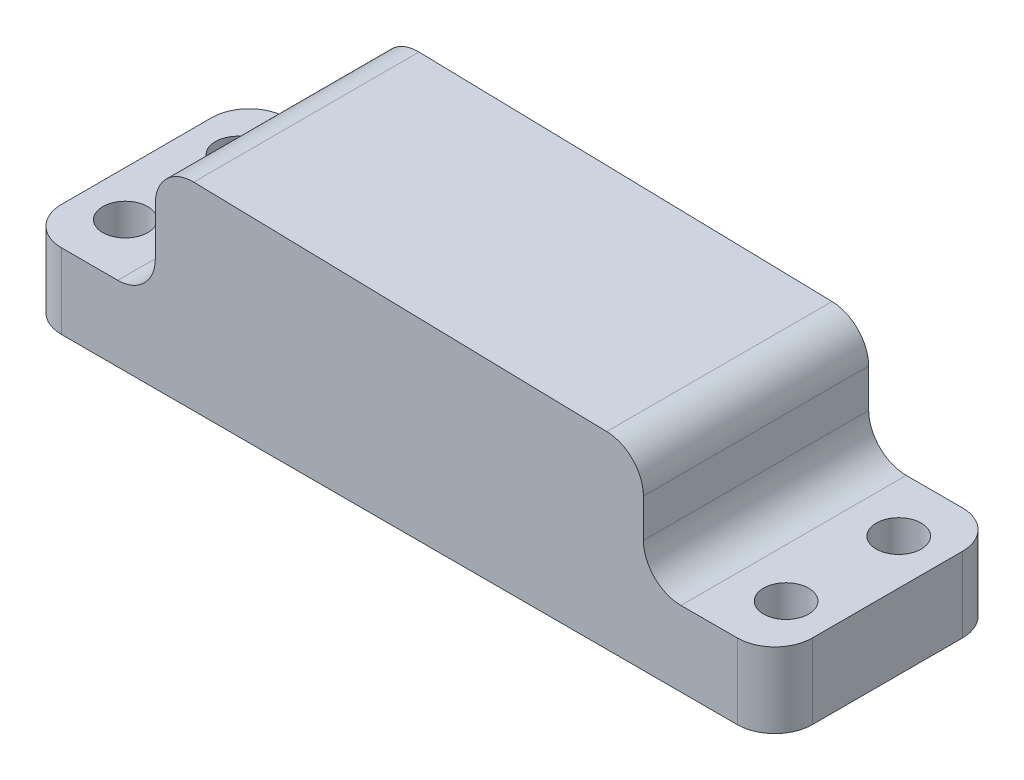
ISO-10303-21;
HEADER;
FILE_DESCRIPTION(('STEP AP214'),'2;1');
FILE_NAME('part.step','',(''),(''),'','','');
FILE_SCHEMA(('AUTOMOTIVE_DESIGN { 1 0 10303 214 1 1 1 1 }'));
ENDSEC;
DATA;
#1=APPLICATION_CONTEXT('core data for automotive mechanical design processes');
#2=APPLICATION_PROTOCOL_DEFINITION('international standard','automotive_design',2000,#1);
#3=PRODUCT_CONTEXT('',#1,'mechanical');
#4=PRODUCT('Part','Part','',(#3));
#5=PRODUCT_RELATED_PRODUCT_CATEGORY('part','',(#4));
#6=PRODUCT_DEFINITION_FORMATION('','',#4);
#7=PRODUCT_DEFINITION_CONTEXT('part definition',#1,'design');
#8=PRODUCT_DEFINITION('design','',#6,#7);
#9=PRODUCT_DEFINITION_SHAPE('','',#8);
#10=(LENGTH_UNIT() NAMED_UNIT(*) SI_UNIT(.MILLI.,.METRE.));
#11=(NAMED_UNIT(*) PLANE_ANGLE_UNIT() SI_UNIT($,.RADIAN.));
#12=(NAMED_UNIT(*) SI_UNIT($,.STERADIAN.) SOLID_ANGLE_UNIT());
#13=UNCERTAINTY_MEASURE_WITH_UNIT(LENGTH_MEASURE(1.E-05),#10,'distance_accuracy_value','');
#14=(GEOMETRIC_REPRESENTATION_CONTEXT(3) GLOBAL_UNCERTAINTY_ASSIGNED_CONTEXT((#13)) GLOBAL_UNIT_ASSIGNED_CONTEXT((#10,
#11,#12)) REPRESENTATION_CONTEXT('',''));
#15=CARTESIAN_POINT('',(0.,0.,0.));
#16=DIRECTION('',(0.,0.,1.));
#17=DIRECTION('',(1.,0.,0.));
#18=AXIS2_PLACEMENT_3D('',#15,#16,#17);
#19=CARTESIAN_POINT('',(200.,0.,60.));
#20=DIRECTION('',(0.,-1.,0.));
#21=DIRECTION('',(0.,0.,-1.));
#22=AXIS2_PLACEMENT_3D('',#19,#20,#21);
#23=PLANE('',#22);
#24=CARTESIAN_POINT('',(188.,0.,45.));
#25=DIRECTION('',(0.,1.,0.));
#26=DIRECTION('',(0.,0.,1.));
#27=AXIS2_PLACEMENT_3D('',#24,#25,#26);
#28=CIRCLE('',#27,4.);
#29=CARTESIAN_POINT('',(188.,0.,49.));
#30=VERTEX_POINT('',#29);
#31=EDGE_CURVE('E359',#30,#30,#28,.T.);
#32=ORIENTED_EDGE('',*,*,#31,.T.);
#33=EDGE_LOOP('',(#32));
#34=FACE_BOUND('',#33,.T.);
#35=CARTESIAN_POINT('',(188.,0.,15.));
#36=DIRECTION('',(0.,1.,0.));
#37=DIRECTION('',(0.,0.,1.));
#38=AXIS2_PLACEMENT_3D('',#35,#36,#37);
#39=CIRCLE('',#38,4.);
#40=CARTESIAN_POINT('',(188.,0.,19.));
#41=VERTEX_POINT('',#40);
#42=EDGE_CURVE('E347',#41,#41,#39,.T.);
#43=ORIENTED_EDGE('',*,*,#42,.T.);
#44=EDGE_LOOP('',(#43));
#45=FACE_BOUND('',#44,.T.);
#46=DIRECTION('',(0.,0.,-1.));
#47=VECTOR('',#46,1.);
#48=CARTESIAN_POINT('',(0.,0.,60.));
#49=LINE('',#48,#47);
#50=CARTESIAN_POINT('',(0.,0.,50.));
#51=VERTEX_POINT('',#50);
#52=CARTESIAN_POINT('',(0.,0.,10.));
#53=VERTEX_POINT('',#52);
#54=EDGE_CURVE('E263',#51,#53,#49,.T.);
#55=ORIENTED_EDGE('',*,*,#54,.T.);
#56=CARTESIAN_POINT('',(10.,0.,10.));
#57=DIRECTION('',(0.,-1.,0.));
#58=DIRECTION('',(0.,0.,-1.));
#59=AXIS2_PLACEMENT_3D('',#56,#57,#58);
#60=CIRCLE('',#59,10.);
#61=CARTESIAN_POINT('',(10.,0.,0.));
#62=VERTEX_POINT('',#61);
#63=EDGE_CURVE('E240',#53,#62,#60,.T.);
#64=ORIENTED_EDGE('',*,*,#63,.T.);
#65=DIRECTION('',(-1.,0.,0.));
#66=VECTOR('',#65,1.);
#67=CARTESIAN_POINT('',(200.,0.,0.));
#68=LINE('',#67,#66);
#69=CARTESIAN_POINT('',(190.,0.,0.));
#70=VERTEX_POINT('',#69);
#71=EDGE_CURVE('E257',#70,#62,#68,.T.);
#72=ORIENTED_EDGE('',*,*,#71,.F.);
#73=CARTESIAN_POINT('',(190.,0.,10.));
#74=DIRECTION('',(0.,-1.,0.));
#75=DIRECTION('',(0.,0.,-1.));
#76=AXIS2_PLACEMENT_3D('',#73,#74,#75);
#77=CIRCLE('',#76,10.);
#78=CARTESIAN_POINT('',(200.,0.,10.));
#79=VERTEX_POINT('',#78);
#80=EDGE_CURVE('E231',#70,#79,#77,.T.);
#81=ORIENTED_EDGE('',*,*,#80,.T.);
#82=DIRECTION('',(0.,0.,-1.));
#83=VECTOR('',#82,1.);
#84=CARTESIAN_POINT('',(200.,0.,60.));
#85=LINE('',#84,#83);
#86=CARTESIAN_POINT('',(200.,0.,50.));
#87=VERTEX_POINT('',#86);
#88=EDGE_CURVE('E186',#87,#79,#85,.T.);
#89=ORIENTED_EDGE('',*,*,#88,.F.);
#90=CARTESIAN_POINT('',(190.,0.,50.));
#91=DIRECTION('',(0.,-1.,0.));
#92=DIRECTION('',(0.,0.,-1.));
#93=AXIS2_PLACEMENT_3D('',#90,#91,#92);
#94=CIRCLE('',#93,10.);
#95=CARTESIAN_POINT('',(190.,0.,60.));
#96=VERTEX_POINT('',#95);
#97=EDGE_CURVE('E234',#87,#96,#94,.T.);
#98=ORIENTED_EDGE('',*,*,#97,.T.);
#99=DIRECTION('',(-1.,0.,0.));
#100=VECTOR('',#99,1.);
#101=CARTESIAN_POINT('',(200.,0.,60.));
#102=LINE('',#101,#100);
#103=CARTESIAN_POINT('',(10.,0.,60.));
#104=VERTEX_POINT('',#103);
#105=EDGE_CURVE('E255',#96,#104,#102,.T.);
#106=ORIENTED_EDGE('',*,*,#105,.T.);
#107=CARTESIAN_POINT('',(10.,0.,50.));
#108=DIRECTION('',(0.,-1.,0.));
#109=DIRECTION('',(0.,0.,-1.));
#110=AXIS2_PLACEMENT_3D('',#107,#108,#109);
#111=CIRCLE('',#110,10.);
#112=EDGE_CURVE('E235',#104,#51,#111,.T.);
#113=ORIENTED_EDGE('',*,*,#112,.T.);
#114=EDGE_LOOP('',(#55,#64,#72,#81,#89,#98,#106,#113));
#115=FACE_BOUND('',#114,.T.);
#116=CARTESIAN_POINT('',(12.,0.,45.));
#117=DIRECTION('',(0.,1.,0.));
#118=DIRECTION('',(0.,0.,1.));
#119=AXIS2_PLACEMENT_3D('',#116,#117,#118);
#120=CIRCLE('',#119,4.);
#121=CARTESIAN_POINT('',(12.,0.,49.));
#122=VERTEX_POINT('',#121);
#123=EDGE_CURVE('E273',#122,#122,#120,.T.);
#124=ORIENTED_EDGE('',*,*,#123,.T.);
#125=EDGE_LOOP('',(#124));
#126=FACE_BOUND('',#125,.T.);
#127=CARTESIAN_POINT('',(12.,0.,15.));
#128=DIRECTION('',(0.,1.,0.));
#129=DIRECTION('',(0.,0.,1.));
#130=AXIS2_PLACEMENT_3D('',#127,#128,#129);
#131=CIRCLE('',#130,4.);
#132=CARTESIAN_POINT('',(12.,0.,19.));
#133=VERTEX_POINT('',#132);
#134=EDGE_CURVE('E331',#133,#133,#131,.T.);
#135=ORIENTED_EDGE('',*,*,#134,.T.);
#136=EDGE_LOOP('',(#135));
#137=FACE_BOUND('',#136,.T.);
#138=ADVANCED_FACE('F41',(#34,#45,#115,#126,#137),#23,.T.);
#139=CARTESIAN_POINT('',(200.,20.,60.));
#140=DIRECTION('',(1.,0.,0.));
#141=DIRECTION('',(0.,0.,-1.));
#142=AXIS2_PLACEMENT_3D('',#139,#140,#141);
#143=PLANE('',#142);
#144=DIRECTION('',(0.,0.,-1.));
#145=VECTOR('',#144,1.);
#146=CARTESIAN_POINT('',(200.,20.,60.));
#147=LINE('',#146,#145);
#148=CARTESIAN_POINT('',(200.,20.,50.));
#149=VERTEX_POINT('',#148);
#150=CARTESIAN_POINT('',(200.,20.,10.));
#151=VERTEX_POINT('',#150);
#152=EDGE_CURVE('E182',#149,#151,#147,.T.);
#153=ORIENTED_EDGE('',*,*,#152,.F.);
#154=DIRECTION('',(0.,-1.,0.));
#155=VECTOR('',#154,1.);
#156=CARTESIAN_POINT('',(200.,0.,50.));
#157=LINE('',#156,#155);
#158=EDGE_CURVE('E244',#149,#87,#157,.T.);
#159=ORIENTED_EDGE('',*,*,#158,.T.);
#160=ORIENTED_EDGE('',*,*,#88,.T.);
#161=DIRECTION('',(0.,-1.,0.));
#162=VECTOR('',#161,1.);
#163=CARTESIAN_POINT('',(200.,20.,10.));
#164=LINE('',#163,#162);
#165=EDGE_CURVE('E57',#79,#151,#164,.F.);
#166=ORIENTED_EDGE('',*,*,#165,.T.);
#167=EDGE_LOOP('',(#153,#159,#160,#166));
#168=FACE_BOUND('',#167,.T.);
#169=ADVANCED_FACE('F261',(#168),#143,.T.);
#170=CARTESIAN_POINT('',(165.,20.,60.));
#171=DIRECTION('',(0.,1.,0.));
#172=DIRECTION('',(0.,0.,1.));
#173=AXIS2_PLACEMENT_3D('',#170,#171,#172);
#174=PLANE('',#173);
#175=CARTESIAN_POINT('',(188.,20.,45.));
#176=DIRECTION('',(0.,1.,0.));
#177=DIRECTION('',(0.,0.,1.));
#178=AXIS2_PLACEMENT_3D('',#175,#176,#177);
#179=CIRCLE('',#178,6.00000000000001);
#180=CARTESIAN_POINT('',(188.,20.,51.));
#181=VERTEX_POINT('',#180);
#182=EDGE_CURVE('E370',#181,#181,#179,.T.);
#183=ORIENTED_EDGE('',*,*,#182,.F.);
#184=EDGE_LOOP('',(#183));
#185=FACE_BOUND('',#184,.T.);
#186=CARTESIAN_POINT('',(188.,20.,15.));
#187=DIRECTION('',(0.,1.,0.));
#188=DIRECTION('',(0.,0.,1.));
#189=AXIS2_PLACEMENT_3D('',#186,#187,#188);
#190=CIRCLE('',#189,6.00000000000001);
#191=CARTESIAN_POINT('',(188.,20.,21.));
#192=VERTEX_POINT('',#191);
#193=EDGE_CURVE('E352',#192,#192,#190,.T.);
#194=ORIENTED_EDGE('',*,*,#193,.F.);
#195=EDGE_LOOP('',(#194));
#196=FACE_BOUND('',#195,.T.);
#197=DIRECTION('',(1.,0.,0.));
#198=VECTOR('',#197,1.);
#199=CARTESIAN_POINT('',(165.,20.,60.));
#200=LINE('',#199,#198);
#201=CARTESIAN_POINT('',(175.,20.,60.));
#202=VERTEX_POINT('',#201);
#203=CARTESIAN_POINT('',(190.,20.,60.));
#204=VERTEX_POINT('',#203);
#205=EDGE_CURVE('E262',#202,#204,#200,.T.);
#206=ORIENTED_EDGE('',*,*,#205,.T.);
#207=CARTESIAN_POINT('',(190.,20.,50.));
#208=DIRECTION('',(0.,1.,0.));
#209=DIRECTION('',(0.,0.,1.));
#210=AXIS2_PLACEMENT_3D('',#207,#208,#209);
#211=CIRCLE('',#210,10.);
#212=EDGE_CURVE('E11',#204,#149,#211,.T.);
#213=ORIENTED_EDGE('',*,*,#212,.T.);
#214=ORIENTED_EDGE('',*,*,#152,.T.);
#215=CARTESIAN_POINT('',(190.,20.,10.));
#216=DIRECTION('',(0.,1.,0.));
#217=DIRECTION('',(0.,0.,1.));
#218=AXIS2_PLACEMENT_3D('',#215,#216,#217);
#219=CIRCLE('',#218,10.);
#220=CARTESIAN_POINT('',(190.,20.,0.));
#221=VERTEX_POINT('',#220);
#222=EDGE_CURVE('E47',#151,#221,#219,.T.);
#223=ORIENTED_EDGE('',*,*,#222,.T.);
#224=DIRECTION('',(1.,0.,0.));
#225=VECTOR('',#224,1.);
#226=CARTESIAN_POINT('',(165.,20.,0.));
#227=LINE('',#226,#225);
#228=CARTESIAN_POINT('',(175.,20.,0.));
#229=VERTEX_POINT('',#228);
#230=EDGE_CURVE('E176',#229,#221,#227,.T.);
#231=ORIENTED_EDGE('',*,*,#230,.F.);
#232=DIRECTION('',(0.,0.,-1.));
#233=VECTOR('',#232,1.);
#234=CARTESIAN_POINT('',(175.,20.,60.));
#235=LINE('',#234,#233);
#236=EDGE_CURVE('E181',#229,#202,#235,.F.);
#237=ORIENTED_EDGE('',*,*,#236,.T.);
#238=EDGE_LOOP('',(#206,#213,#214,#223,#231,#237));
#239=FACE_BOUND('',#238,.T.);
#240=ADVANCED_FACE('F248',(#185,#196,#239),#174,.T.);
#241=CARTESIAN_POINT('',(165.,50.,60.));
#242=DIRECTION('',(1.,0.,0.));
#243=DIRECTION('',(0.,0.,-1.));
#244=AXIS2_PLACEMENT_3D('',#241,#242,#243);
#245=PLANE('',#244);
#246=DIRECTION('',(0.,-1.,0.));
#247=VECTOR('',#246,1.);
#248=CARTESIAN_POINT('',(165.,50.,60.));
#249=LINE('',#248,#247);
#250=CARTESIAN_POINT('',(165.,40.2281068632858,60.));
#251=VERTEX_POINT('',#250);
#252=CARTESIAN_POINT('',(165.,30.,60.));
#253=VERTEX_POINT('',#252);
#254=EDGE_CURVE('E264',#251,#253,#249,.T.);
#255=ORIENTED_EDGE('',*,*,#254,.T.);
#256=DIRECTION('',(0.,0.,-1.));
#257=VECTOR('',#256,1.);
#258=CARTESIAN_POINT('',(165.,30.,0.));
#259=LINE('',#258,#257);
#260=CARTESIAN_POINT('',(165.,30.,0.));
#261=VERTEX_POINT('',#260);
#262=EDGE_CURVE('E172',#253,#261,#259,.T.);
#263=ORIENTED_EDGE('',*,*,#262,.T.);
#264=DIRECTION('',(0.,-1.,0.));
#265=VECTOR('',#264,1.);
#266=CARTESIAN_POINT('',(165.,50.,0.));
#267=LINE('',#266,#265);
#268=CARTESIAN_POINT('',(165.,40.2281068632858,0.));
#269=VERTEX_POINT('',#268);
#270=EDGE_CURVE('E158',#269,#261,#267,.T.);
#271=ORIENTED_EDGE('',*,*,#270,.F.);
#272=DIRECTION('',(0.,0.,-1.));
#273=VECTOR('',#272,1.);
#274=CARTESIAN_POINT('',(165.,40.2281068632858,60.));
#275=LINE('',#274,#273);
#276=EDGE_CURVE('E175',#269,#251,#275,.F.);
#277=ORIENTED_EDGE('',*,*,#276,.T.);
#278=EDGE_LOOP('',(#255,#263,#271,#277));
#279=FACE_BOUND('',#278,.T.);
#280=ADVANCED_FACE('F173',(#279),#245,.T.);
#281=CARTESIAN_POINT('',(35.,53.,60.));
#282=DIRECTION('',(0.0230707807872643,0.999733834114794,0.));
#283=DIRECTION('',(-0.999733834114794,0.0230707807872643,0.));
#284=AXIS2_PLACEMENT_3D('',#281,#282,#283);
#285=PLANE('',#284);
#286=DIRECTION('',(0.999733834114794,-0.0230707807872643,0.));
#287=VECTOR('',#286,1.);
#288=CARTESIAN_POINT('',(35.,53.,60.));
#289=LINE('',#288,#287);
#290=CARTESIAN_POINT('',(45.2307078078726,52.7639067428952,60.));
#291=VERTEX_POINT('',#290);
#292=CARTESIAN_POINT('',(155.230707807873,50.2254452044337,60.));
#293=VERTEX_POINT('',#292);
#294=EDGE_CURVE('E268',#291,#293,#289,.T.);
#295=ORIENTED_EDGE('',*,*,#294,.T.);
#296=DIRECTION('',(0.,0.,-1.));
#297=VECTOR('',#296,1.);
#298=CARTESIAN_POINT('',(155.230707807873,50.2254452044337,60.));
#299=LINE('',#298,#297);
#300=CARTESIAN_POINT('',(155.230707807873,50.2254452044337,0.));
#301=VERTEX_POINT('',#300);
#302=EDGE_CURVE('E193',#293,#301,#299,.T.);
#303=ORIENTED_EDGE('',*,*,#302,.T.);
#304=DIRECTION('',(0.999733834114794,-0.0230707807872643,0.));
#305=VECTOR('',#304,1.);
#306=CARTESIAN_POINT('',(35.,53.,0.));
#307=LINE('',#306,#305);
#308=CARTESIAN_POINT('',(45.2307078078726,52.7639067428952,0.));
#309=VERTEX_POINT('',#308);
#310=EDGE_CURVE('E159',#309,#301,#307,.T.);
#311=ORIENTED_EDGE('',*,*,#310,.F.);
#312=DIRECTION('',(0.,0.,-1.));
#313=VECTOR('',#312,1.);
#314=CARTESIAN_POINT('',(45.2307078078726,52.7639067428952,60.));
#315=LINE('',#314,#313);
#316=EDGE_CURVE('E192',#309,#291,#315,.F.);
#317=ORIENTED_EDGE('',*,*,#316,.T.);
#318=EDGE_LOOP('',(#295,#303,#311,#317));
#319=FACE_BOUND('',#318,.T.);
#320=ADVANCED_FACE('F312',(#319),#285,.T.);
#321=CARTESIAN_POINT('',(35.,20.,60.));
#322=DIRECTION('',(-1.,0.,0.));
#323=DIRECTION('',(0.,0.,1.));
#324=AXIS2_PLACEMENT_3D('',#321,#322,#323);
#325=PLANE('',#324);
#326=DIRECTION('',(0.,1.,0.));
#327=VECTOR('',#326,1.);
#328=CARTESIAN_POINT('',(35.,20.,0.));
#329=LINE('',#328,#327);
#330=CARTESIAN_POINT('',(35.,30.,0.));
#331=VERTEX_POINT('',#330);
#332=CARTESIAN_POINT('',(35.,42.7665684017473,0.));
#333=VERTEX_POINT('',#332);
#334=EDGE_CURVE('E277',#331,#333,#329,.T.);
#335=ORIENTED_EDGE('',*,*,#334,.F.);
#336=DIRECTION('',(0.,0.,-1.));
#337=VECTOR('',#336,1.);
#338=CARTESIAN_POINT('',(35.,30.,60.));
#339=LINE('',#338,#337);
#340=CARTESIAN_POINT('',(35.,30.,60.));
#341=VERTEX_POINT('',#340);
#342=EDGE_CURVE('E202',#331,#341,#339,.F.);
#343=ORIENTED_EDGE('',*,*,#342,.T.);
#344=DIRECTION('',(0.,1.,0.));
#345=VECTOR('',#344,1.);
#346=CARTESIAN_POINT('',(35.,20.,60.));
#347=LINE('',#346,#345);
#348=CARTESIAN_POINT('',(35.,42.7665684017473,60.));
#349=VERTEX_POINT('',#348);
#350=EDGE_CURVE('E306',#341,#349,#347,.T.);
#351=ORIENTED_EDGE('',*,*,#350,.T.);
#352=DIRECTION('',(0.,0.,-1.));
#353=VECTOR('',#352,1.);
#354=CARTESIAN_POINT('',(35.,42.7665684017473,60.));
#355=LINE('',#354,#353);
#356=EDGE_CURVE('E205',#349,#333,#355,.T.);
#357=ORIENTED_EDGE('',*,*,#356,.T.);
#358=EDGE_LOOP('',(#335,#343,#351,#357));
#359=FACE_BOUND('',#358,.T.);
#360=ADVANCED_FACE('F303',(#359),#325,.T.);
#361=CARTESIAN_POINT('',(0.,20.,60.));
#362=DIRECTION('',(0.,1.,0.));
#363=DIRECTION('',(0.,0.,1.));
#364=AXIS2_PLACEMENT_3D('',#361,#362,#363);
#365=PLANE('',#364);
#366=CARTESIAN_POINT('',(12.,20.,15.));
#367=DIRECTION('',(0.,1.,0.));
#368=DIRECTION('',(0.,0.,1.));
#369=AXIS2_PLACEMENT_3D('',#366,#367,#368);
#370=CIRCLE('',#369,6.);
#371=CARTESIAN_POINT('',(12.,20.,21.));
#372=VERTEX_POINT('',#371);
#373=EDGE_CURVE('E344',#372,#372,#370,.T.);
#374=ORIENTED_EDGE('',*,*,#373,.F.);
#375=EDGE_LOOP('',(#374));
#376=FACE_BOUND('',#375,.T.);
#377=CARTESIAN_POINT('',(12.,20.,45.));
#378=DIRECTION('',(0.,1.,0.));
#379=DIRECTION('',(0.,0.,1.));
#380=AXIS2_PLACEMENT_3D('',#377,#378,#379);
#381=CIRCLE('',#380,6.);
#382=CARTESIAN_POINT('',(12.,20.,51.));
#383=VERTEX_POINT('',#382);
#384=EDGE_CURVE('E332',#383,#383,#381,.T.);
#385=ORIENTED_EDGE('',*,*,#384,.F.);
#386=EDGE_LOOP('',(#385));
#387=FACE_BOUND('',#386,.T.);
#388=DIRECTION('',(1.,0.,0.));
#389=VECTOR('',#388,1.);
#390=CARTESIAN_POINT('',(0.,20.,0.));
#391=LINE('',#390,#389);
#392=CARTESIAN_POINT('',(10.,20.,0.));
#393=VERTEX_POINT('',#392);
#394=CARTESIAN_POINT('',(25.,20.,0.));
#395=VERTEX_POINT('',#394);
#396=EDGE_CURVE('E272',#393,#395,#391,.T.);
#397=ORIENTED_EDGE('',*,*,#396,.F.);
#398=CARTESIAN_POINT('',(10.,20.,10.));
#399=DIRECTION('',(0.,1.,0.));
#400=DIRECTION('',(0.,0.,1.));
#401=AXIS2_PLACEMENT_3D('',#398,#399,#400);
#402=CIRCLE('',#401,10.);
#403=CARTESIAN_POINT('',(0.,20.,10.));
#404=VERTEX_POINT('',#403);
#405=EDGE_CURVE('E221',#393,#404,#402,.T.);
#406=ORIENTED_EDGE('',*,*,#405,.T.);
#407=DIRECTION('',(0.,0.,-1.));
#408=VECTOR('',#407,1.);
#409=CARTESIAN_POINT('',(0.,20.,60.));
#410=LINE('',#409,#408);
#411=CARTESIAN_POINT('',(0.,20.,50.));
#412=VERTEX_POINT('',#411);
#413=EDGE_CURVE('E183',#412,#404,#410,.T.);
#414=ORIENTED_EDGE('',*,*,#413,.F.);
#415=CARTESIAN_POINT('',(10.,20.,50.));
#416=DIRECTION('',(0.,1.,0.));
#417=DIRECTION('',(0.,0.,1.));
#418=AXIS2_PLACEMENT_3D('',#415,#416,#417);
#419=CIRCLE('',#418,10.);
#420=CARTESIAN_POINT('',(10.,20.,60.));
#421=VERTEX_POINT('',#420);
#422=EDGE_CURVE('E225',#412,#421,#419,.T.);
#423=ORIENTED_EDGE('',*,*,#422,.T.);
#424=DIRECTION('',(1.,0.,0.));
#425=VECTOR('',#424,1.);
#426=CARTESIAN_POINT('',(0.,20.,60.));
#427=LINE('',#426,#425);
#428=CARTESIAN_POINT('',(25.,20.,60.));
#429=VERTEX_POINT('',#428);
#430=EDGE_CURVE('E300',#421,#429,#427,.T.);
#431=ORIENTED_EDGE('',*,*,#430,.T.);
#432=DIRECTION('',(0.,0.,-1.));
#433=VECTOR('',#432,1.);
#434=CARTESIAN_POINT('',(25.,20.,0.));
#435=LINE('',#434,#433);
#436=EDGE_CURVE('E200',#429,#395,#435,.T.);
#437=ORIENTED_EDGE('',*,*,#436,.T.);
#438=EDGE_LOOP('',(#397,#406,#414,#423,#431,#437));
#439=FACE_BOUND('',#438,.T.);
#440=ADVANCED_FACE('F294',(#376,#387,#439),#365,.T.);
#441=CARTESIAN_POINT('',(0.,0.,60.));
#442=DIRECTION('',(-1.,0.,0.));
#443=DIRECTION('',(0.,0.,1.));
#444=AXIS2_PLACEMENT_3D('',#441,#442,#443);
#445=PLANE('',#444);
#446=ORIENTED_EDGE('',*,*,#413,.T.);
#447=DIRECTION('',(0.,1.,0.));
#448=VECTOR('',#447,1.);
#449=CARTESIAN_POINT('',(0.,0.,10.));
#450=LINE('',#449,#448);
#451=EDGE_CURVE('E229',#404,#53,#450,.F.);
#452=ORIENTED_EDGE('',*,*,#451,.T.);
#453=ORIENTED_EDGE('',*,*,#54,.F.);
#454=DIRECTION('',(0.,1.,0.));
#455=VECTOR('',#454,1.);
#456=CARTESIAN_POINT('',(0.,20.,50.));
#457=LINE('',#456,#455);
#458=EDGE_CURVE('E228',#51,#412,#457,.T.);
#459=ORIENTED_EDGE('',*,*,#458,.T.);
#460=EDGE_LOOP('',(#446,#452,#453,#459));
#461=FACE_BOUND('',#460,.T.);
#462=ADVANCED_FACE('F284',(#461),#445,.T.);
#463=CARTESIAN_POINT('',(0.,0.,60.));
#464=DIRECTION('',(0.,0.,-1.));
#465=DIRECTION('',(-1.,0.,0.));
#466=AXIS2_PLACEMENT_3D('',#463,#464,#465);
#467=PLANE('',#466);
#468=ORIENTED_EDGE('',*,*,#430,.F.);
#469=DIRECTION('',(0.,1.,0.));
#470=VECTOR('',#469,1.);
#471=CARTESIAN_POINT('',(10.,0.,60.));
#472=LINE('',#471,#470);
#473=EDGE_CURVE('E243',#421,#104,#472,.F.);
#474=ORIENTED_EDGE('',*,*,#473,.T.);
#475=ORIENTED_EDGE('',*,*,#105,.F.);
#476=DIRECTION('',(0.,-1.,0.));
#477=VECTOR('',#476,1.);
#478=CARTESIAN_POINT('',(190.,20.,60.));
#479=LINE('',#478,#477);
#480=EDGE_CURVE('E239',#96,#204,#479,.F.);
#481=ORIENTED_EDGE('',*,*,#480,.T.);
#482=ORIENTED_EDGE('',*,*,#205,.F.);
#483=CARTESIAN_POINT('',(175.,30.,60.));
#484=DIRECTION('',(0.,0.,-1.));
#485=DIRECTION('',(-1.,0.,0.));
#486=AXIS2_PLACEMENT_3D('',#483,#484,#485);
#487=CIRCLE('',#486,10.);
#488=EDGE_CURVE('E207',#202,#253,#487,.T.);
#489=ORIENTED_EDGE('',*,*,#488,.T.);
#490=ORIENTED_EDGE('',*,*,#254,.F.);
#491=CARTESIAN_POINT('',(155.,40.2281068632858,60.));
#492=DIRECTION('',(0.,0.,-1.));
#493=DIRECTION('',(-1.,0.,0.));
#494=AXIS2_PLACEMENT_3D('',#491,#492,#493);
#495=CIRCLE('',#494,10.);
#496=EDGE_CURVE('E180',#251,#293,#495,.F.);
#497=ORIENTED_EDGE('',*,*,#496,.T.);
#498=ORIENTED_EDGE('',*,*,#294,.F.);
#499=CARTESIAN_POINT('',(45.,42.7665684017473,60.));
#500=DIRECTION('',(0.,0.,-1.));
#501=DIRECTION('',(-1.,0.,0.));
#502=AXIS2_PLACEMENT_3D('',#499,#500,#501);
#503=CIRCLE('',#502,10.);
#504=EDGE_CURVE('E164',#291,#349,#503,.F.);
#505=ORIENTED_EDGE('',*,*,#504,.T.);
#506=ORIENTED_EDGE('',*,*,#350,.F.);
#507=CARTESIAN_POINT('',(25.,30.,60.));
#508=DIRECTION('',(0.,0.,-1.));
#509=DIRECTION('',(-1.,0.,0.));
#510=AXIS2_PLACEMENT_3D('',#507,#508,#509);
#511=CIRCLE('',#510,10.);
#512=EDGE_CURVE('E213',#341,#429,#511,.T.);
#513=ORIENTED_EDGE('',*,*,#512,.T.);
#514=EDGE_LOOP('',(#468,#474,#475,#481,#482,#489,#490,#497,#498,#505,#506,#513));
#515=FACE_BOUND('',#514,.T.);
#516=ADVANCED_FACE('F429',(#515),#467,.F.);
#517=CARTESIAN_POINT('',(0.,0.,0.));
#518=DIRECTION('',(0.,0.,-1.));
#519=DIRECTION('',(-1.,0.,0.));
#520=AXIS2_PLACEMENT_3D('',#517,#518,#519);
#521=PLANE('',#520);
#522=ORIENTED_EDGE('',*,*,#71,.T.);
#523=DIRECTION('',(0.,1.,0.));
#524=VECTOR('',#523,1.);
#525=CARTESIAN_POINT('',(10.,0.,0.));
#526=LINE('',#525,#524);
#527=EDGE_CURVE('E218',#62,#393,#526,.T.);
#528=ORIENTED_EDGE('',*,*,#527,.T.);
#529=ORIENTED_EDGE('',*,*,#396,.T.);
#530=CARTESIAN_POINT('',(25.,30.,0.));
#531=DIRECTION('',(0.,0.,-1.));
#532=DIRECTION('',(-1.,0.,0.));
#533=AXIS2_PLACEMENT_3D('',#530,#531,#532);
#534=CIRCLE('',#533,10.);
#535=EDGE_CURVE('E211',#395,#331,#534,.F.);
#536=ORIENTED_EDGE('',*,*,#535,.T.);
#537=ORIENTED_EDGE('',*,*,#334,.T.);
#538=CARTESIAN_POINT('',(45.,42.7665684017473,0.));
#539=DIRECTION('',(0.,0.,-1.));
#540=DIRECTION('',(-1.,0.,0.));
#541=AXIS2_PLACEMENT_3D('',#538,#539,#540);
#542=CIRCLE('',#541,10.);
#543=EDGE_CURVE('E167',#333,#309,#542,.T.);
#544=ORIENTED_EDGE('',*,*,#543,.T.);
#545=ORIENTED_EDGE('',*,*,#310,.T.);
#546=CARTESIAN_POINT('',(155.,40.2281068632858,0.));
#547=DIRECTION('',(0.,0.,-1.));
#548=DIRECTION('',(-1.,0.,0.));
#549=AXIS2_PLACEMENT_3D('',#546,#547,#548);
#550=CIRCLE('',#549,10.);
#551=EDGE_CURVE('E152',#301,#269,#550,.T.);
#552=ORIENTED_EDGE('',*,*,#551,.T.);
#553=ORIENTED_EDGE('',*,*,#270,.T.);
#554=CARTESIAN_POINT('',(175.,30.,0.));
#555=DIRECTION('',(0.,0.,-1.));
#556=DIRECTION('',(-1.,0.,0.));
#557=AXIS2_PLACEMENT_3D('',#554,#555,#556);
#558=CIRCLE('',#557,10.);
#559=EDGE_CURVE('E210',#261,#229,#558,.F.);
#560=ORIENTED_EDGE('',*,*,#559,.T.);
#561=ORIENTED_EDGE('',*,*,#230,.T.);
#562=DIRECTION('',(0.,-1.,0.));
#563=VECTOR('',#562,1.);
#564=CARTESIAN_POINT('',(190.,0.,0.));
#565=LINE('',#564,#563);
#566=EDGE_CURVE('E216',#221,#70,#565,.T.);
#567=ORIENTED_EDGE('',*,*,#566,.T.);
#568=EDGE_LOOP('',(#522,#528,#529,#536,#537,#544,#545,#552,#553,#560,#561,#567));
#569=FACE_BOUND('',#568,.T.);
#570=ADVANCED_FACE('F160',(#569),#521,.T.);
#571=CARTESIAN_POINT('',(12.,20.,45.));
#572=DIRECTION('',(0.,1.,0.));
#573=DIRECTION('',(0.,0.,1.));
#574=AXIS2_PLACEMENT_3D('',#571,#572,#573);
#575=CYLINDRICAL_SURFACE('',#574,4.);
#576=ORIENTED_EDGE('',*,*,#123,.F.);
#577=EDGE_LOOP('',(#576));
#578=FACE_BOUND('',#577,.T.);
#579=CARTESIAN_POINT('',(12.,10.,45.));
#580=DIRECTION('',(0.,1.,0.));
#581=DIRECTION('',(0.,0.,1.));
#582=AXIS2_PLACEMENT_3D('',#579,#580,#581);
#583=CIRCLE('',#582,4.);
#584=CARTESIAN_POINT('',(12.,10.,49.));
#585=VERTEX_POINT('',#584);
#586=EDGE_CURVE('E324',#585,#585,#583,.T.);
#587=ORIENTED_EDGE('',*,*,#586,.T.);
#588=EDGE_LOOP('',(#587));
#589=FACE_BOUND('',#588,.T.);
#590=ADVANCED_FACE('F438',(#578,#589),#575,.F.);
#591=CARTESIAN_POINT('',(16.,10.,45.));
#592=DIRECTION('',(0.,-1.,0.));
#593=DIRECTION('',(0.,0.,-1.));
#594=AXIS2_PLACEMENT_3D('',#591,#592,#593);
#595=PLANE('',#594);
#596=ORIENTED_EDGE('',*,*,#586,.F.);
#597=EDGE_LOOP('',(#596));
#598=FACE_BOUND('',#597,.T.);
#599=CARTESIAN_POINT('',(12.,10.,45.));
#600=DIRECTION('',(0.,1.,0.));
#601=DIRECTION('',(0.,0.,1.));
#602=AXIS2_PLACEMENT_3D('',#599,#600,#601);
#603=CIRCLE('',#602,6.);
#604=CARTESIAN_POINT('',(12.,10.,51.));
#605=VERTEX_POINT('',#604);
#606=EDGE_CURVE('E327',#605,#605,#603,.T.);
#607=ORIENTED_EDGE('',*,*,#606,.T.);
#608=EDGE_LOOP('',(#607));
#609=FACE_BOUND('',#608,.T.);
#610=ADVANCED_FACE('F458',(#598,#609),#595,.F.);
#611=CARTESIAN_POINT('',(12.,20.,45.));
#612=DIRECTION('',(0.,1.,0.));
#613=DIRECTION('',(0.,0.,1.));
#614=AXIS2_PLACEMENT_3D('',#611,#612,#613);
#615=CYLINDRICAL_SURFACE('',#614,6.);
#616=ORIENTED_EDGE('',*,*,#606,.F.);
#617=EDGE_LOOP('',(#616));
#618=FACE_BOUND('',#617,.T.);
#619=ORIENTED_EDGE('',*,*,#384,.T.);
#620=EDGE_LOOP('',(#619));
#621=FACE_BOUND('',#620,.T.);
#622=ADVANCED_FACE('F460',(#618,#621),#615,.F.);
#623=CARTESIAN_POINT('',(12.,20.,15.));
#624=DIRECTION('',(0.,1.,0.));
#625=DIRECTION('',(0.,0.,1.));
#626=AXIS2_PLACEMENT_3D('',#623,#624,#625);
#627=CYLINDRICAL_SURFACE('',#626,4.);
#628=ORIENTED_EDGE('',*,*,#134,.F.);
#629=EDGE_LOOP('',(#628));
#630=FACE_BOUND('',#629,.T.);
#631=CARTESIAN_POINT('',(12.,10.,15.));
#632=DIRECTION('',(0.,1.,0.));
#633=DIRECTION('',(0.,0.,1.));
#634=AXIS2_PLACEMENT_3D('',#631,#632,#633);
#635=CIRCLE('',#634,4.);
#636=CARTESIAN_POINT('',(12.,10.,19.));
#637=VERTEX_POINT('',#636);
#638=EDGE_CURVE('E340',#637,#637,#635,.T.);
#639=ORIENTED_EDGE('',*,*,#638,.T.);
#640=EDGE_LOOP('',(#639));
#641=FACE_BOUND('',#640,.T.);
#642=ADVANCED_FACE('F459',(#630,#641),#627,.F.);
#643=CARTESIAN_POINT('',(16.,10.,15.));
#644=DIRECTION('',(0.,-1.,0.));
#645=DIRECTION('',(0.,0.,-1.));
#646=AXIS2_PLACEMENT_3D('',#643,#644,#645);
#647=PLANE('',#646);
#648=ORIENTED_EDGE('',*,*,#638,.F.);
#649=EDGE_LOOP('',(#648));
#650=FACE_BOUND('',#649,.T.);
#651=CARTESIAN_POINT('',(12.,10.,15.));
#652=DIRECTION('',(0.,1.,0.));
#653=DIRECTION('',(0.,0.,1.));
#654=AXIS2_PLACEMENT_3D('',#651,#652,#653);
#655=CIRCLE('',#654,6.);
#656=CARTESIAN_POINT('',(12.,10.,21.));
#657=VERTEX_POINT('',#656);
#658=EDGE_CURVE('E337',#657,#657,#655,.T.);
#659=ORIENTED_EDGE('',*,*,#658,.T.);
#660=EDGE_LOOP('',(#659));
#661=FACE_BOUND('',#660,.T.);
#662=ADVANCED_FACE('F467',(#650,#661),#647,.F.);
#663=CARTESIAN_POINT('',(12.,20.,15.));
#664=DIRECTION('',(0.,1.,0.));
#665=DIRECTION('',(0.,0.,1.));
#666=AXIS2_PLACEMENT_3D('',#663,#664,#665);
#667=CYLINDRICAL_SURFACE('',#666,6.);
#668=ORIENTED_EDGE('',*,*,#658,.F.);
#669=EDGE_LOOP('',(#668));
#670=FACE_BOUND('',#669,.T.);
#671=ORIENTED_EDGE('',*,*,#373,.T.);
#672=EDGE_LOOP('',(#671));
#673=FACE_BOUND('',#672,.T.);
#674=ADVANCED_FACE('F474',(#670,#673),#667,.F.);
#675=CARTESIAN_POINT('',(188.,20.,15.));
#676=DIRECTION('',(0.,1.,0.));
#677=DIRECTION('',(0.,0.,1.));
#678=AXIS2_PLACEMENT_3D('',#675,#676,#677);
#679=CYLINDRICAL_SURFACE('',#678,4.);
#680=ORIENTED_EDGE('',*,*,#42,.F.);
#681=EDGE_LOOP('',(#680));
#682=FACE_BOUND('',#681,.T.);
#683=CARTESIAN_POINT('',(188.,10.,15.));
#684=DIRECTION('',(0.,1.,0.));
#685=DIRECTION('',(0.,0.,1.));
#686=AXIS2_PLACEMENT_3D('',#683,#684,#685);
#687=CIRCLE('',#686,4.);
#688=CARTESIAN_POINT('',(188.,10.,19.));
#689=VERTEX_POINT('',#688);
#690=EDGE_CURVE('E349',#689,#689,#687,.T.);
#691=ORIENTED_EDGE('',*,*,#690,.T.);
#692=EDGE_LOOP('',(#691));
#693=FACE_BOUND('',#692,.T.);
#694=ADVANCED_FACE('F393',(#682,#693),#679,.F.);
#695=CARTESIAN_POINT('',(192.,10.,15.));
#696=DIRECTION('',(0.,-1.,0.));
#697=DIRECTION('',(0.,0.,-1.));
#698=AXIS2_PLACEMENT_3D('',#695,#696,#697);
#699=PLANE('',#698);
#700=ORIENTED_EDGE('',*,*,#690,.F.);
#701=EDGE_LOOP('',(#700));
#702=FACE_BOUND('',#701,.T.);
#703=CARTESIAN_POINT('',(188.,10.,15.));
#704=DIRECTION('',(0.,1.,0.));
#705=DIRECTION('',(0.,0.,1.));
#706=AXIS2_PLACEMENT_3D('',#703,#704,#705);
#707=CIRCLE('',#706,6.00000000000001);
#708=CARTESIAN_POINT('',(188.,10.,21.));
#709=VERTEX_POINT('',#708);
#710=EDGE_CURVE('E355',#709,#709,#707,.T.);
#711=ORIENTED_EDGE('',*,*,#710,.T.);
#712=EDGE_LOOP('',(#711));
#713=FACE_BOUND('',#712,.T.);
#714=ADVANCED_FACE('F381',(#702,#713),#699,.F.);
#715=CARTESIAN_POINT('',(188.,20.,15.));
#716=DIRECTION('',(0.,1.,0.));
#717=DIRECTION('',(0.,0.,1.));
#718=AXIS2_PLACEMENT_3D('',#715,#716,#717);
#719=CYLINDRICAL_SURFACE('',#718,6.00000000000001);
#720=ORIENTED_EDGE('',*,*,#710,.F.);
#721=EDGE_LOOP('',(#720));
#722=FACE_BOUND('',#721,.T.);
#723=ORIENTED_EDGE('',*,*,#193,.T.);
#724=EDGE_LOOP('',(#723));
#725=FACE_BOUND('',#724,.T.);
#726=ADVANCED_FACE('F378',(#722,#725),#719,.F.);
#727=CARTESIAN_POINT('',(188.,20.,45.));
#728=DIRECTION('',(0.,1.,0.));
#729=DIRECTION('',(0.,0.,1.));
#730=AXIS2_PLACEMENT_3D('',#727,#728,#729);
#731=CYLINDRICAL_SURFACE('',#730,4.);
#732=ORIENTED_EDGE('',*,*,#31,.F.);
#733=EDGE_LOOP('',(#732));
#734=FACE_BOUND('',#733,.T.);
#735=CARTESIAN_POINT('',(188.,10.,45.));
#736=DIRECTION('',(0.,1.,0.));
#737=DIRECTION('',(0.,0.,1.));
#738=AXIS2_PLACEMENT_3D('',#735,#736,#737);
#739=CIRCLE('',#738,4.);
#740=CARTESIAN_POINT('',(188.,10.,49.));
#741=VERTEX_POINT('',#740);
#742=EDGE_CURVE('E363',#741,#741,#739,.T.);
#743=ORIENTED_EDGE('',*,*,#742,.T.);
#744=EDGE_LOOP('',(#743));
#745=FACE_BOUND('',#744,.T.);
#746=ADVANCED_FACE('F379',(#734,#745),#731,.F.);
#747=CARTESIAN_POINT('',(192.,10.,45.));
#748=DIRECTION('',(0.,-1.,0.));
#749=DIRECTION('',(0.,0.,-1.));
#750=AXIS2_PLACEMENT_3D('',#747,#748,#749);
#751=PLANE('',#750);
#752=ORIENTED_EDGE('',*,*,#742,.F.);
#753=EDGE_LOOP('',(#752));
#754=FACE_BOUND('',#753,.T.);
#755=CARTESIAN_POINT('',(188.,10.,45.));
#756=DIRECTION('',(0.,1.,0.));
#757=DIRECTION('',(0.,0.,1.));
#758=AXIS2_PLACEMENT_3D('',#755,#756,#757);
#759=CIRCLE('',#758,6.00000000000001);
#760=CARTESIAN_POINT('',(188.,10.,51.));
#761=VERTEX_POINT('',#760);
#762=EDGE_CURVE('E365',#761,#761,#759,.T.);
#763=ORIENTED_EDGE('',*,*,#762,.T.);
#764=EDGE_LOOP('',(#763));
#765=FACE_BOUND('',#764,.T.);
#766=ADVANCED_FACE('F389',(#754,#765),#751,.F.);
#767=CARTESIAN_POINT('',(188.,20.,45.));
#768=DIRECTION('',(0.,1.,0.));
#769=DIRECTION('',(0.,0.,1.));
#770=AXIS2_PLACEMENT_3D('',#767,#768,#769);
#771=CYLINDRICAL_SURFACE('',#770,6.00000000000001);
#772=ORIENTED_EDGE('',*,*,#762,.F.);
#773=EDGE_LOOP('',(#772));
#774=FACE_BOUND('',#773,.T.);
#775=ORIENTED_EDGE('',*,*,#182,.T.);
#776=EDGE_LOOP('',(#775));
#777=FACE_BOUND('',#776,.T.);
#778=ADVANCED_FACE('F371',(#774,#777),#771,.F.);
#779=CARTESIAN_POINT('',(175.,30.,60.));
#780=DIRECTION('',(0.,0.,1.));
#781=DIRECTION('',(1.,0.,0.));
#782=AXIS2_PLACEMENT_3D('',#779,#780,#781);
#783=CYLINDRICAL_SURFACE('',#782,10.);
#784=ORIENTED_EDGE('',*,*,#488,.F.);
#785=ORIENTED_EDGE('',*,*,#236,.F.);
#786=ORIENTED_EDGE('',*,*,#559,.F.);
#787=ORIENTED_EDGE('',*,*,#262,.F.);
#788=EDGE_LOOP('',(#784,#785,#786,#787));
#789=FACE_BOUND('',#788,.T.);
#790=ADVANCED_FACE('F410',(#789),#783,.F.);
#791=CARTESIAN_POINT('',(155.,40.2281068632858,60.));
#792=DIRECTION('',(0.,0.,-1.));
#793=DIRECTION('',(-1.,0.,0.));
#794=AXIS2_PLACEMENT_3D('',#791,#792,#793);
#795=CYLINDRICAL_SURFACE('',#794,10.);
#796=ORIENTED_EDGE('',*,*,#496,.F.);
#797=ORIENTED_EDGE('',*,*,#276,.F.);
#798=ORIENTED_EDGE('',*,*,#551,.F.);
#799=ORIENTED_EDGE('',*,*,#302,.F.);
#800=EDGE_LOOP('',(#796,#797,#798,#799));
#801=FACE_BOUND('',#800,.T.);
#802=ADVANCED_FACE('F178',(#801),#795,.T.);
#803=CARTESIAN_POINT('',(25.,30.,60.));
#804=DIRECTION('',(0.,0.,1.));
#805=DIRECTION('',(1.,0.,0.));
#806=AXIS2_PLACEMENT_3D('',#803,#804,#805);
#807=CYLINDRICAL_SURFACE('',#806,10.);
#808=ORIENTED_EDGE('',*,*,#512,.F.);
#809=ORIENTED_EDGE('',*,*,#342,.F.);
#810=ORIENTED_EDGE('',*,*,#535,.F.);
#811=ORIENTED_EDGE('',*,*,#436,.F.);
#812=EDGE_LOOP('',(#808,#809,#810,#811));
#813=FACE_BOUND('',#812,.T.);
#814=ADVANCED_FACE('F297',(#813),#807,.F.);
#815=CARTESIAN_POINT('',(45.,42.7665684017473,60.));
#816=DIRECTION('',(0.,0.,-1.));
#817=DIRECTION('',(-1.,0.,0.));
#818=AXIS2_PLACEMENT_3D('',#815,#816,#817);
#819=CYLINDRICAL_SURFACE('',#818,10.);
#820=ORIENTED_EDGE('',*,*,#504,.F.);
#821=ORIENTED_EDGE('',*,*,#316,.F.);
#822=ORIENTED_EDGE('',*,*,#543,.F.);
#823=ORIENTED_EDGE('',*,*,#356,.F.);
#824=EDGE_LOOP('',(#820,#821,#822,#823));
#825=FACE_BOUND('',#824,.T.);
#826=ADVANCED_FACE('F313',(#825),#819,.T.);
#827=CARTESIAN_POINT('',(10.,0.,10.));
#828=DIRECTION('',(0.,1.,0.));
#829=DIRECTION('',(0.,0.,1.));
#830=AXIS2_PLACEMENT_3D('',#827,#828,#829);
#831=CYLINDRICAL_SURFACE('',#830,10.);
#832=ORIENTED_EDGE('',*,*,#63,.F.);
#833=ORIENTED_EDGE('',*,*,#451,.F.);
#834=ORIENTED_EDGE('',*,*,#405,.F.);
#835=ORIENTED_EDGE('',*,*,#527,.F.);
#836=EDGE_LOOP('',(#832,#833,#834,#835));
#837=FACE_BOUND('',#836,.T.);
#838=ADVANCED_FACE('F290',(#837),#831,.T.);
#839=CARTESIAN_POINT('',(10.,0.,50.));
#840=DIRECTION('',(0.,-1.,0.));
#841=DIRECTION('',(0.,0.,-1.));
#842=AXIS2_PLACEMENT_3D('',#839,#840,#841);
#843=CYLINDRICAL_SURFACE('',#842,10.);
#844=ORIENTED_EDGE('',*,*,#112,.F.);
#845=ORIENTED_EDGE('',*,*,#473,.F.);
#846=ORIENTED_EDGE('',*,*,#422,.F.);
#847=ORIENTED_EDGE('',*,*,#458,.F.);
#848=EDGE_LOOP('',(#844,#845,#846,#847));
#849=FACE_BOUND('',#848,.T.);
#850=ADVANCED_FACE('F416',(#849),#843,.T.);
#851=CARTESIAN_POINT('',(190.,20.,50.));
#852=DIRECTION('',(0.,1.,0.));
#853=DIRECTION('',(0.,0.,1.));
#854=AXIS2_PLACEMENT_3D('',#851,#852,#853);
#855=CYLINDRICAL_SURFACE('',#854,10.);
#856=ORIENTED_EDGE('',*,*,#212,.F.);
#857=ORIENTED_EDGE('',*,*,#480,.F.);
#858=ORIENTED_EDGE('',*,*,#97,.F.);
#859=ORIENTED_EDGE('',*,*,#158,.F.);
#860=EDGE_LOOP('',(#856,#857,#858,#859));
#861=FACE_BOUND('',#860,.T.);
#862=ADVANCED_FACE('F419',(#861),#855,.T.);
#863=CARTESIAN_POINT('',(190.,0.,10.));
#864=DIRECTION('',(0.,-1.,0.));
#865=DIRECTION('',(0.,0.,-1.));
#866=AXIS2_PLACEMENT_3D('',#863,#864,#865);
#867=CYLINDRICAL_SURFACE('',#866,10.);
#868=ORIENTED_EDGE('',*,*,#222,.F.);
#869=ORIENTED_EDGE('',*,*,#165,.F.);
#870=ORIENTED_EDGE('',*,*,#80,.F.);
#871=ORIENTED_EDGE('',*,*,#566,.F.);
#872=EDGE_LOOP('',(#868,#869,#870,#871));
#873=FACE_BOUND('',#872,.T.);
#874=ADVANCED_FACE('F43',(#873),#867,.T.);
#875=CLOSED_SHELL('',(#138,#169,#240,#280,#320,#360,#440,#462,#516,#570,#590,#610,#622,#642,
#662,#674,#694,#714,#726,#746,#766,#778,#790,#802,#814,#826,#838,#850,#862,#874));
#876=MANIFOLD_SOLID_BREP('B2',#875);
#877=ADVANCED_BREP_SHAPE_REPRESENTATION('',(#18,#876),#14);
#878=SHAPE_DEFINITION_REPRESENTATION(#9,#877);
ENDSEC;
END-ISO-10303-21;
